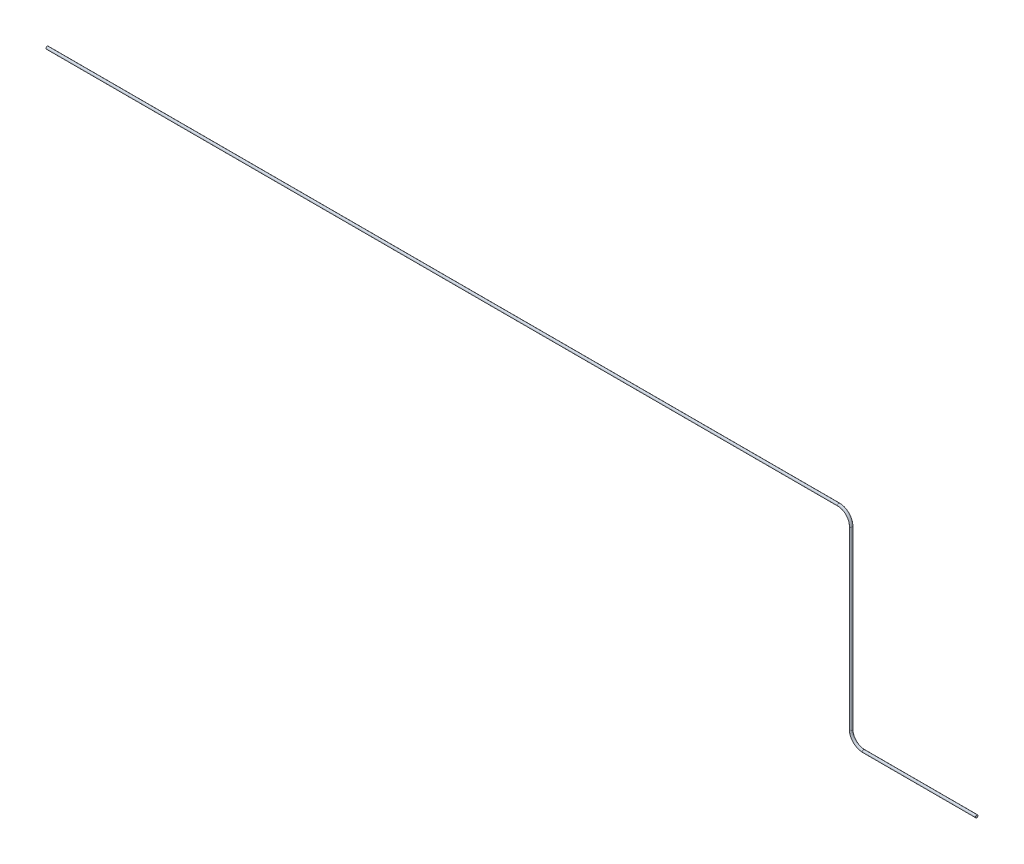
ISO-10303-21;
HEADER;
FILE_DESCRIPTION(('STEP AP214'),'2;1');
FILE_NAME('part.step','',(''),(''),'','','');
FILE_SCHEMA(('AUTOMOTIVE_DESIGN { 1 0 10303 214 1 1 1 1 }'));
ENDSEC;
DATA;
#1=APPLICATION_CONTEXT('core data for automotive mechanical design processes');
#2=APPLICATION_PROTOCOL_DEFINITION('international standard','automotive_design',2000,#1);
#3=PRODUCT_CONTEXT('',#1,'mechanical');
#4=PRODUCT('Part','Part','',(#3));
#5=PRODUCT_RELATED_PRODUCT_CATEGORY('part','',(#4));
#6=PRODUCT_DEFINITION_FORMATION('','',#4);
#7=PRODUCT_DEFINITION_CONTEXT('part definition',#1,'design');
#8=PRODUCT_DEFINITION('design','',#6,#7);
#9=PRODUCT_DEFINITION_SHAPE('','',#8);
#10=(LENGTH_UNIT() NAMED_UNIT(*) SI_UNIT(.MILLI.,.METRE.));
#11=(NAMED_UNIT(*) PLANE_ANGLE_UNIT() SI_UNIT($,.RADIAN.));
#12=(NAMED_UNIT(*) SI_UNIT($,.STERADIAN.) SOLID_ANGLE_UNIT());
#13=UNCERTAINTY_MEASURE_WITH_UNIT(LENGTH_MEASURE(1.E-05),#10,'distance_accuracy_value','');
#14=(GEOMETRIC_REPRESENTATION_CONTEXT(3) GLOBAL_UNCERTAINTY_ASSIGNED_CONTEXT((#13)) GLOBAL_UNIT_ASSIGNED_CONTEXT((#10,
#11,#12)) REPRESENTATION_CONTEXT('',''));
#15=CARTESIAN_POINT('',(0.,0.,0.));
#16=DIRECTION('',(0.,0.,1.));
#17=DIRECTION('',(1.,0.,0.));
#18=AXIS2_PLACEMENT_3D('',#15,#16,#17);
#19=CARTESIAN_POINT('',(-320.,40.0000000000001,0.));
#20=DIRECTION('',(1.,0.,0.));
#21=DIRECTION('',(0.,0.,-1.));
#22=AXIS2_PLACEMENT_3D('',#19,#20,#21);
#23=PLANE('',#22);
#24=CARTESIAN_POINT('',(-320.,40.0000000000001,0.));
#25=DIRECTION('',(1.,0.,0.));
#26=DIRECTION('',(0.,0.,-1.));
#27=AXIS2_PLACEMENT_3D('',#24,#25,#26);
#28=CIRCLE('',#27,0.5);
#29=CARTESIAN_POINT('',(-320.,40.0000000000001,-0.5));
#30=VERTEX_POINT('',#29);
#31=EDGE_CURVE('E64',#30,#30,#28,.T.);
#32=ORIENTED_EDGE('',*,*,#31,.F.);
#33=EDGE_LOOP('',(#32));
#34=FACE_BOUND('',#33,.T.);
#35=ADVANCED_FACE('F37',(#34),#23,.F.);
#36=CARTESIAN_POINT('',(50.,-40.,0.));
#37=DIRECTION('',(1.,0.,0.));
#38=DIRECTION('',(0.,0.,-1.));
#39=AXIS2_PLACEMENT_3D('',#36,#37,#38);
#40=PLANE('',#39);
#41=CARTESIAN_POINT('',(50.,-40.,0.));
#42=DIRECTION('',(1.,0.,0.));
#43=DIRECTION('',(0.,0.,-1.));
#44=AXIS2_PLACEMENT_3D('',#41,#42,#43);
#45=CIRCLE('',#44,0.5);
#46=CARTESIAN_POINT('',(50.,-40.,-0.5));
#47=VERTEX_POINT('',#46);
#48=EDGE_CURVE('E10',#47,#47,#45,.T.);
#49=ORIENTED_EDGE('',*,*,#48,.T.);
#50=EDGE_LOOP('',(#49));
#51=FACE_BOUND('',#50,.T.);
#52=ADVANCED_FACE('F72',(#51),#40,.T.);
#53=CARTESIAN_POINT('',(-320.,40.0000000000001,0.));
#54=DIRECTION('',(1.,0.,0.));
#55=DIRECTION('',(0.,1.,0.));
#56=AXIS2_PLACEMENT_3D('',#53,#54,#55);
#57=CYLINDRICAL_SURFACE('',#56,0.5);
#58=CARTESIAN_POINT('',(-5.00000000000001,40.,0.));
#59=DIRECTION('',(1.,0.,0.));
#60=DIRECTION('',(0.,0.,-1.));
#61=AXIS2_PLACEMENT_3D('',#58,#59,#60);
#62=CIRCLE('',#61,0.5);
#63=CARTESIAN_POINT('',(-5.00000000000001,40.5,0.));
#64=VERTEX_POINT('',#63);
#65=EDGE_CURVE('E60',#64,#64,#62,.T.);
#66=ORIENTED_EDGE('',*,*,#65,.F.);
#67=EDGE_LOOP('',(#66));
#68=FACE_BOUND('',#67,.T.);
#69=ORIENTED_EDGE('',*,*,#31,.T.);
#70=EDGE_LOOP('',(#69));
#71=FACE_BOUND('',#70,.T.);
#72=ADVANCED_FACE('F69',(#68,#71),#57,.T.);
#73=CARTESIAN_POINT('',(-5.,35.,0.));
#74=DIRECTION('',(0.,0.,-1.));
#75=DIRECTION('',(-1.,0.,0.));
#76=AXIS2_PLACEMENT_3D('',#73,#74,#75);
#77=TOROIDAL_SURFACE('',#76,5.00000000000001,0.5);
#78=CARTESIAN_POINT('',(0.,35.,0.));
#79=DIRECTION('',(0.,-1.,0.));
#80=DIRECTION('',(0.,0.,-1.));
#81=AXIS2_PLACEMENT_3D('',#78,#79,#80);
#82=CIRCLE('',#81,0.5);
#83=CARTESIAN_POINT('',(0.500000000000008,35.,0.));
#84=VERTEX_POINT('',#83);
#85=EDGE_CURVE('E54',#84,#84,#82,.T.);
#86=CARTESIAN_POINT('',(-5.,35.,0.));
#87=DIRECTION('',(0.,0.,-1.));
#88=DIRECTION('',(-1.,0.,0.));
#89=AXIS2_PLACEMENT_3D('',#86,#87,#88);
#90=CIRCLE('',#89,5.50000000000001);
#91=EDGE_CURVE('',#64,#84,#90,.T.);
#92=ORIENTED_EDGE('',*,*,#65,.T.);
#93=ORIENTED_EDGE('',*,*,#85,.F.);
#94=ORIENTED_EDGE('',*,*,#91,.T.);
#95=ORIENTED_EDGE('',*,*,#91,.F.);
#96=EDGE_LOOP('',(#92,#94,#93,#95));
#97=FACE_BOUND('',#96,.T.);
#98=ADVANCED_FACE('F90',(#97),#77,.T.);
#99=CARTESIAN_POINT('',(0.,35.,0.));
#100=DIRECTION('',(0.,-1.,0.));
#101=DIRECTION('',(1.,0.,0.));
#102=AXIS2_PLACEMENT_3D('',#99,#100,#101);
#103=CYLINDRICAL_SURFACE('',#102,0.5);
#104=CARTESIAN_POINT('',(0.,-35.,0.));
#105=DIRECTION('',(0.,-1.,0.));
#106=DIRECTION('',(0.,0.,-1.));
#107=AXIS2_PLACEMENT_3D('',#104,#105,#106);
#108=CIRCLE('',#107,0.5);
#109=CARTESIAN_POINT('',(-0.49999999999998,-35.,0.));
#110=VERTEX_POINT('',#109);
#111=EDGE_CURVE('E49',#110,#110,#108,.T.);
#112=ORIENTED_EDGE('',*,*,#111,.F.);
#113=EDGE_LOOP('',(#112));
#114=FACE_BOUND('',#113,.T.);
#115=ORIENTED_EDGE('',*,*,#85,.T.);
#116=EDGE_LOOP('',(#115));
#117=FACE_BOUND('',#116,.T.);
#118=ADVANCED_FACE('F84',(#114,#117),#103,.T.);
#119=CARTESIAN_POINT('',(5.00000000000001,-35.,0.));
#120=DIRECTION('',(0.,0.,1.));
#121=DIRECTION('',(1.,0.,0.));
#122=AXIS2_PLACEMENT_3D('',#119,#120,#121);
#123=TOROIDAL_SURFACE('',#122,4.99999999999998,0.5);
#124=CARTESIAN_POINT('',(5.,-40.,0.));
#125=DIRECTION('',(1.,0.,0.));
#126=DIRECTION('',(0.,0.,-1.));
#127=AXIS2_PLACEMENT_3D('',#124,#125,#126);
#128=CIRCLE('',#127,0.5);
#129=CARTESIAN_POINT('',(5.,-40.5,0.));
#130=VERTEX_POINT('',#129);
#131=EDGE_CURVE('E44',#130,#130,#128,.T.);
#132=CARTESIAN_POINT('',(5.00000000000001,-35.,0.));
#133=DIRECTION('',(0.,0.,1.));
#134=DIRECTION('',(1.,0.,0.));
#135=AXIS2_PLACEMENT_3D('',#132,#133,#134);
#136=CIRCLE('',#135,5.49999999999998);
#137=EDGE_CURVE('',#110,#130,#136,.T.);
#138=ORIENTED_EDGE('',*,*,#111,.T.);
#139=ORIENTED_EDGE('',*,*,#131,.F.);
#140=ORIENTED_EDGE('',*,*,#137,.T.);
#141=ORIENTED_EDGE('',*,*,#137,.F.);
#142=EDGE_LOOP('',(#138,#140,#139,#141));
#143=FACE_BOUND('',#142,.T.);
#144=ADVANCED_FACE('F78',(#143),#123,.T.);
#145=CARTESIAN_POINT('',(5.,-40.,0.));
#146=DIRECTION('',(1.,0.,0.));
#147=DIRECTION('',(0.,1.,0.));
#148=AXIS2_PLACEMENT_3D('',#145,#146,#147);
#149=CYLINDRICAL_SURFACE('',#148,0.5);
#150=ORIENTED_EDGE('',*,*,#48,.F.);
#151=EDGE_LOOP('',(#150));
#152=FACE_BOUND('',#151,.T.);
#153=ORIENTED_EDGE('',*,*,#131,.T.);
#154=EDGE_LOOP('',(#153));
#155=FACE_BOUND('',#154,.T.);
#156=ADVANCED_FACE('F76',(#152,#155),#149,.T.);
#157=CLOSED_SHELL('',(#35,#52,#72,#98,#118,#144,#156));
#158=MANIFOLD_SOLID_BREP('B2',#157);
#159=ADVANCED_BREP_SHAPE_REPRESENTATION('',(#18,#158),#14);
#160=SHAPE_DEFINITION_REPRESENTATION(#9,#159);
ENDSEC;
END-ISO-10303-21;
